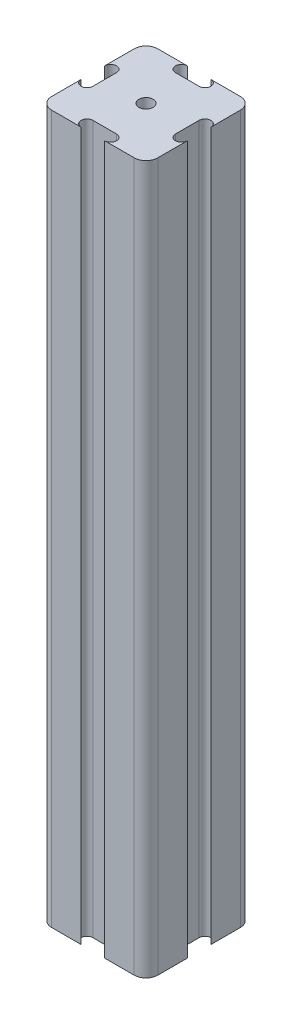
ISO-10303-21;
HEADER;
FILE_DESCRIPTION(('STEP AP214'),'2;1');
FILE_NAME('part.step','',(''),(''),'','','');
FILE_SCHEMA(('AUTOMOTIVE_DESIGN { 1 0 10303 214 1 1 1 1 }'));
ENDSEC;
DATA;
#1=APPLICATION_CONTEXT('core data for automotive mechanical design processes');
#2=APPLICATION_PROTOCOL_DEFINITION('international standard','automotive_design',2000,#1);
#3=PRODUCT_CONTEXT('',#1,'mechanical');
#4=PRODUCT('Part','Part','',(#3));
#5=PRODUCT_RELATED_PRODUCT_CATEGORY('part','',(#4));
#6=PRODUCT_DEFINITION_FORMATION('','',#4);
#7=PRODUCT_DEFINITION_CONTEXT('part definition',#1,'design');
#8=PRODUCT_DEFINITION('design','',#6,#7);
#9=PRODUCT_DEFINITION_SHAPE('','',#8);
#10=(LENGTH_UNIT() NAMED_UNIT(*) SI_UNIT(.MILLI.,.METRE.));
#11=(NAMED_UNIT(*) PLANE_ANGLE_UNIT() SI_UNIT($,.RADIAN.));
#12=(NAMED_UNIT(*) SI_UNIT($,.STERADIAN.) SOLID_ANGLE_UNIT());
#13=UNCERTAINTY_MEASURE_WITH_UNIT(LENGTH_MEASURE(1.E-05),#10,'distance_accuracy_value','');
#14=(GEOMETRIC_REPRESENTATION_CONTEXT(3) GLOBAL_UNCERTAINTY_ASSIGNED_CONTEXT((#13)) GLOBAL_UNIT_ASSIGNED_CONTEXT((#10,
#11,#12)) REPRESENTATION_CONTEXT('',''));
#15=CARTESIAN_POINT('',(0.,0.,0.));
#16=DIRECTION('',(0.,0.,1.));
#17=DIRECTION('',(1.,0.,0.));
#18=AXIS2_PLACEMENT_3D('',#15,#16,#17);
#19=CARTESIAN_POINT('',(-20.,300.,5.));
#20=DIRECTION('',(0.,-1.,0.));
#21=DIRECTION('',(0.,0.,-1.));
#22=AXIS2_PLACEMENT_3D('',#19,#20,#21);
#23=CYLINDRICAL_SURFACE('',#22,2.5);
#24=CARTESIAN_POINT('',(-20.,0.,5.));
#25=DIRECTION('',(0.,-1.,0.));
#26=DIRECTION('',(0.,0.,-1.));
#27=AXIS2_PLACEMENT_3D('',#24,#25,#26);
#28=CIRCLE('',#27,2.5);
#29=CARTESIAN_POINT('',(-17.5,0.,5.));
#30=VERTEX_POINT('',#29);
#31=CARTESIAN_POINT('',(-22.5,0.,5.));
#32=VERTEX_POINT('',#31);
#33=EDGE_CURVE('E225',#30,#32,#28,.T.);
#34=ORIENTED_EDGE('',*,*,#33,.T.);
#35=DIRECTION('',(0.,-1.,0.));
#36=VECTOR('',#35,1.);
#37=CARTESIAN_POINT('',(-22.5,300.,5.));
#38=LINE('',#37,#36);
#39=CARTESIAN_POINT('',(-22.5,300.,5.));
#40=VERTEX_POINT('',#39);
#41=EDGE_CURVE('E11',#40,#32,#38,.T.);
#42=ORIENTED_EDGE('',*,*,#41,.F.);
#43=CARTESIAN_POINT('',(-20.,300.,5.));
#44=DIRECTION('',(0.,-1.,0.));
#45=DIRECTION('',(0.,0.,-1.));
#46=AXIS2_PLACEMENT_3D('',#43,#44,#45);
#47=CIRCLE('',#46,2.5);
#48=CARTESIAN_POINT('',(-17.5,300.,5.));
#49=VERTEX_POINT('',#48);
#50=EDGE_CURVE('E290',#49,#40,#47,.T.);
#51=ORIENTED_EDGE('',*,*,#50,.F.);
#52=DIRECTION('',(0.,-1.,0.));
#53=VECTOR('',#52,1.);
#54=CARTESIAN_POINT('',(-17.5,300.,5.));
#55=LINE('',#54,#53);
#56=EDGE_CURVE('E221',#49,#30,#55,.T.);
#57=ORIENTED_EDGE('',*,*,#56,.T.);
#58=EDGE_LOOP('',(#34,#42,#51,#57));
#59=FACE_BOUND('',#58,.T.);
#60=ADVANCED_FACE('F33',(#59),#23,.F.);
#61=CARTESIAN_POINT('',(-22.5,300.,5.));
#62=DIRECTION('',(1.,0.,0.));
#63=DIRECTION('',(0.,0.,-1.));
#64=AXIS2_PLACEMENT_3D('',#61,#62,#63);
#65=PLANE('',#64);
#66=DIRECTION('',(0.,0.,1.));
#67=VECTOR('',#66,1.);
#68=CARTESIAN_POINT('',(-22.5,0.,5.));
#69=LINE('',#68,#67);
#70=CARTESIAN_POINT('',(-22.5,0.,17.4999999999999));
#71=VERTEX_POINT('',#70);
#72=EDGE_CURVE('E228',#32,#71,#69,.T.);
#73=ORIENTED_EDGE('',*,*,#72,.T.);
#74=DIRECTION('',(0.,-1.,0.));
#75=VECTOR('',#74,1.);
#76=CARTESIAN_POINT('',(-22.5,300.,17.4999999999999));
#77=LINE('',#76,#75);
#78=CARTESIAN_POINT('',(-22.5,300.,17.4999999999999));
#79=VERTEX_POINT('',#78);
#80=EDGE_CURVE('E41',#79,#71,#77,.T.);
#81=ORIENTED_EDGE('',*,*,#80,.F.);
#82=DIRECTION('',(0.,0.,1.));
#83=VECTOR('',#82,1.);
#84=CARTESIAN_POINT('',(-22.5,300.,5.));
#85=LINE('',#84,#83);
#86=EDGE_CURVE('E136',#40,#79,#85,.T.);
#87=ORIENTED_EDGE('',*,*,#86,.F.);
#88=ORIENTED_EDGE('',*,*,#41,.T.);
#89=EDGE_LOOP('',(#73,#81,#87,#88));
#90=FACE_BOUND('',#89,.T.);
#91=ADVANCED_FACE('F417',(#90),#65,.F.);
#92=CARTESIAN_POINT('',(-17.5,300.,17.5));
#93=DIRECTION('',(0.,-1.,0.));
#94=DIRECTION('',(0.,0.,-1.));
#95=AXIS2_PLACEMENT_3D('',#92,#93,#94);
#96=CYLINDRICAL_SURFACE('',#95,5.);
#97=CARTESIAN_POINT('',(-17.5,0.,17.5));
#98=DIRECTION('',(0.,1.,0.));
#99=DIRECTION('',(0.,0.,1.));
#100=AXIS2_PLACEMENT_3D('',#97,#98,#99);
#101=CIRCLE('',#100,5.);
#102=CARTESIAN_POINT('',(-17.5,0.,22.5));
#103=VERTEX_POINT('',#102);
#104=EDGE_CURVE('E231',#71,#103,#101,.T.);
#105=ORIENTED_EDGE('',*,*,#104,.T.);
#106=DIRECTION('',(0.,-1.,0.));
#107=VECTOR('',#106,1.);
#108=CARTESIAN_POINT('',(-17.5,300.,22.5));
#109=LINE('',#108,#107);
#110=CARTESIAN_POINT('',(-17.5,300.,22.5));
#111=VERTEX_POINT('',#110);
#112=EDGE_CURVE('E329',#111,#103,#109,.T.);
#113=ORIENTED_EDGE('',*,*,#112,.F.);
#114=CARTESIAN_POINT('',(-17.5,300.,17.5));
#115=DIRECTION('',(0.,1.,0.));
#116=DIRECTION('',(0.,0.,1.));
#117=AXIS2_PLACEMENT_3D('',#114,#115,#116);
#118=CIRCLE('',#117,5.);
#119=EDGE_CURVE('E336',#79,#111,#118,.T.);
#120=ORIENTED_EDGE('',*,*,#119,.F.);
#121=ORIENTED_EDGE('',*,*,#80,.T.);
#122=EDGE_LOOP('',(#105,#113,#120,#121));
#123=FACE_BOUND('',#122,.T.);
#124=ADVANCED_FACE('F334',(#123),#96,.T.);
#125=CARTESIAN_POINT('',(-4.99999999999998,300.,22.5));
#126=DIRECTION('',(0.,0.,1.));
#127=DIRECTION('',(1.,0.,0.));
#128=AXIS2_PLACEMENT_3D('',#125,#126,#127);
#129=PLANE('',#128);
#130=DIRECTION('',(-1.,0.,0.));
#131=VECTOR('',#130,1.);
#132=CARTESIAN_POINT('',(-4.99999999999998,0.,22.5));
#133=LINE('',#132,#131);
#134=CARTESIAN_POINT('',(-4.99999999999998,0.,22.5));
#135=VERTEX_POINT('',#134);
#136=EDGE_CURVE('E234',#135,#103,#133,.T.);
#137=ORIENTED_EDGE('',*,*,#136,.F.);
#138=DIRECTION('',(0.,-1.,0.));
#139=VECTOR('',#138,1.);
#140=CARTESIAN_POINT('',(-4.99999999999998,300.,22.5));
#141=LINE('',#140,#139);
#142=CARTESIAN_POINT('',(-4.99999999999998,300.,22.5));
#143=VERTEX_POINT('',#142);
#144=EDGE_CURVE('E327',#143,#135,#141,.T.);
#145=ORIENTED_EDGE('',*,*,#144,.F.);
#146=DIRECTION('',(-1.,0.,0.));
#147=VECTOR('',#146,1.);
#148=CARTESIAN_POINT('',(-4.99999999999998,300.,22.5));
#149=LINE('',#148,#147);
#150=EDGE_CURVE('E347',#143,#111,#149,.T.);
#151=ORIENTED_EDGE('',*,*,#150,.T.);
#152=ORIENTED_EDGE('',*,*,#112,.T.);
#153=EDGE_LOOP('',(#137,#145,#151,#152));
#154=FACE_BOUND('',#153,.T.);
#155=ADVANCED_FACE('F344',(#154),#129,.T.);
#156=CARTESIAN_POINT('',(-5.,300.,20.));
#157=DIRECTION('',(0.,-1.,0.));
#158=DIRECTION('',(0.,0.,-1.));
#159=AXIS2_PLACEMENT_3D('',#156,#157,#158);
#160=CYLINDRICAL_SURFACE('',#159,2.5);
#161=CARTESIAN_POINT('',(-5.,0.,20.));
#162=DIRECTION('',(0.,1.,0.));
#163=DIRECTION('',(0.,0.,1.));
#164=AXIS2_PLACEMENT_3D('',#161,#162,#163);
#165=CIRCLE('',#164,2.5);
#166=CARTESIAN_POINT('',(-4.99999999999998,0.,17.5));
#167=VERTEX_POINT('',#166);
#168=EDGE_CURVE('E237',#167,#135,#165,.T.);
#169=ORIENTED_EDGE('',*,*,#168,.F.);
#170=DIRECTION('',(0.,-1.,0.));
#171=VECTOR('',#170,1.);
#172=CARTESIAN_POINT('',(-4.99999999999998,300.,17.5));
#173=LINE('',#172,#171);
#174=CARTESIAN_POINT('',(-4.99999999999998,300.,17.5));
#175=VERTEX_POINT('',#174);
#176=EDGE_CURVE('E325',#175,#167,#173,.T.);
#177=ORIENTED_EDGE('',*,*,#176,.F.);
#178=CARTESIAN_POINT('',(-5.,300.,20.));
#179=DIRECTION('',(0.,1.,0.));
#180=DIRECTION('',(0.,0.,1.));
#181=AXIS2_PLACEMENT_3D('',#178,#179,#180);
#182=CIRCLE('',#181,2.5);
#183=EDGE_CURVE('E350',#175,#143,#182,.T.);
#184=ORIENTED_EDGE('',*,*,#183,.T.);
#185=ORIENTED_EDGE('',*,*,#144,.T.);
#186=EDGE_LOOP('',(#169,#177,#184,#185));
#187=FACE_BOUND('',#186,.T.);
#188=ADVANCED_FACE('F624',(#187),#160,.F.);
#189=CARTESIAN_POINT('',(-4.99999999999998,300.,17.5));
#190=DIRECTION('',(0.,0.,-1.));
#191=DIRECTION('',(-1.,0.,0.));
#192=AXIS2_PLACEMENT_3D('',#189,#190,#191);
#193=PLANE('',#192);
#194=DIRECTION('',(1.,0.,0.));
#195=VECTOR('',#194,1.);
#196=CARTESIAN_POINT('',(-4.99999999999998,0.,17.5));
#197=LINE('',#196,#195);
#198=CARTESIAN_POINT('',(5.00000000000002,0.,17.5));
#199=VERTEX_POINT('',#198);
#200=EDGE_CURVE('E240',#167,#199,#197,.T.);
#201=ORIENTED_EDGE('',*,*,#200,.T.);
#202=DIRECTION('',(0.,-1.,0.));
#203=VECTOR('',#202,1.);
#204=CARTESIAN_POINT('',(5.00000000000002,300.,17.5));
#205=LINE('',#204,#203);
#206=CARTESIAN_POINT('',(5.00000000000002,300.,17.5));
#207=VERTEX_POINT('',#206);
#208=EDGE_CURVE('E323',#207,#199,#205,.T.);
#209=ORIENTED_EDGE('',*,*,#208,.F.);
#210=DIRECTION('',(1.,0.,0.));
#211=VECTOR('',#210,1.);
#212=CARTESIAN_POINT('',(-4.99999999999998,300.,17.5));
#213=LINE('',#212,#211);
#214=EDGE_CURVE('E352',#175,#207,#213,.T.);
#215=ORIENTED_EDGE('',*,*,#214,.F.);
#216=ORIENTED_EDGE('',*,*,#176,.T.);
#217=EDGE_LOOP('',(#201,#209,#215,#216));
#218=FACE_BOUND('',#217,.T.);
#219=ADVANCED_FACE('F614',(#218),#193,.F.);
#220=CARTESIAN_POINT('',(4.99999999999996,300.,20.));
#221=DIRECTION('',(0.,-1.,0.));
#222=DIRECTION('',(0.,0.,-1.));
#223=AXIS2_PLACEMENT_3D('',#220,#221,#222);
#224=CYLINDRICAL_SURFACE('',#223,2.50000000000001);
#225=CARTESIAN_POINT('',(4.99999999999996,0.,20.));
#226=DIRECTION('',(0.,1.,0.));
#227=DIRECTION('',(0.,0.,1.));
#228=AXIS2_PLACEMENT_3D('',#225,#226,#227);
#229=CIRCLE('',#228,2.50000000000001);
#230=CARTESIAN_POINT('',(4.99999999999996,0.,22.5));
#231=VERTEX_POINT('',#230);
#232=EDGE_CURVE('E243',#231,#199,#229,.T.);
#233=ORIENTED_EDGE('',*,*,#232,.F.);
#234=DIRECTION('',(0.,-1.,0.));
#235=VECTOR('',#234,1.);
#236=CARTESIAN_POINT('',(4.99999999999996,300.,22.5));
#237=LINE('',#236,#235);
#238=CARTESIAN_POINT('',(4.99999999999996,300.,22.5));
#239=VERTEX_POINT('',#238);
#240=EDGE_CURVE('E321',#239,#231,#237,.T.);
#241=ORIENTED_EDGE('',*,*,#240,.F.);
#242=CARTESIAN_POINT('',(4.99999999999996,300.,20.));
#243=DIRECTION('',(0.,1.,0.));
#244=DIRECTION('',(0.,0.,1.));
#245=AXIS2_PLACEMENT_3D('',#242,#243,#244);
#246=CIRCLE('',#245,2.50000000000001);
#247=EDGE_CURVE('E358',#239,#207,#246,.T.);
#248=ORIENTED_EDGE('',*,*,#247,.T.);
#249=ORIENTED_EDGE('',*,*,#208,.T.);
#250=EDGE_LOOP('',(#233,#241,#248,#249));
#251=FACE_BOUND('',#250,.T.);
#252=ADVANCED_FACE('F604',(#251),#224,.F.);
#253=CARTESIAN_POINT('',(4.99999999999996,300.,22.5));
#254=DIRECTION('',(0.,0.,-1.));
#255=DIRECTION('',(-1.,0.,0.));
#256=AXIS2_PLACEMENT_3D('',#253,#254,#255);
#257=PLANE('',#256);
#258=DIRECTION('',(1.,0.,0.));
#259=VECTOR('',#258,1.);
#260=CARTESIAN_POINT('',(4.99999999999996,0.,22.5));
#261=LINE('',#260,#259);
#262=CARTESIAN_POINT('',(17.5,0.,22.5));
#263=VERTEX_POINT('',#262);
#264=EDGE_CURVE('E246',#231,#263,#261,.T.);
#265=ORIENTED_EDGE('',*,*,#264,.T.);
#266=DIRECTION('',(0.,-1.,0.));
#267=VECTOR('',#266,1.);
#268=CARTESIAN_POINT('',(17.5,300.,22.5));
#269=LINE('',#268,#267);
#270=CARTESIAN_POINT('',(17.5,300.,22.5));
#271=VERTEX_POINT('',#270);
#272=EDGE_CURVE('E318',#271,#263,#269,.T.);
#273=ORIENTED_EDGE('',*,*,#272,.F.);
#274=DIRECTION('',(1.,0.,0.));
#275=VECTOR('',#274,1.);
#276=CARTESIAN_POINT('',(4.99999999999996,300.,22.5));
#277=LINE('',#276,#275);
#278=EDGE_CURVE('E361',#239,#271,#277,.T.);
#279=ORIENTED_EDGE('',*,*,#278,.F.);
#280=ORIENTED_EDGE('',*,*,#240,.T.);
#281=EDGE_LOOP('',(#265,#273,#279,#280));
#282=FACE_BOUND('',#281,.T.);
#283=ADVANCED_FACE('F594',(#282),#257,.F.);
#284=CARTESIAN_POINT('',(17.5000000000006,300.,17.5));
#285=DIRECTION('',(0.,-1.,0.));
#286=DIRECTION('',(0.,0.,-1.));
#287=AXIS2_PLACEMENT_3D('',#284,#285,#286);
#288=CYLINDRICAL_SURFACE('',#287,5.);
#289=CARTESIAN_POINT('',(17.5000000000006,0.,17.5));
#290=DIRECTION('',(0.,1.,0.));
#291=DIRECTION('',(0.,0.,1.));
#292=AXIS2_PLACEMENT_3D('',#289,#290,#291);
#293=CIRCLE('',#292,5.);
#294=CARTESIAN_POINT('',(22.5,0.,17.5000025246919));
#295=VERTEX_POINT('',#294);
#296=EDGE_CURVE('E248',#263,#295,#293,.T.);
#297=ORIENTED_EDGE('',*,*,#296,.T.);
#298=DIRECTION('',(0.,-1.,0.));
#299=VECTOR('',#298,1.);
#300=CARTESIAN_POINT('',(22.5,300.,17.5000025246919));
#301=LINE('',#300,#299);
#302=CARTESIAN_POINT('',(22.5,300.,17.5000025246919));
#303=VERTEX_POINT('',#302);
#304=EDGE_CURVE('E316',#303,#295,#301,.T.);
#305=ORIENTED_EDGE('',*,*,#304,.F.);
#306=CARTESIAN_POINT('',(17.5000000000006,300.,17.5));
#307=DIRECTION('',(0.,1.,0.));
#308=DIRECTION('',(0.,0.,1.));
#309=AXIS2_PLACEMENT_3D('',#306,#307,#308);
#310=CIRCLE('',#309,5.);
#311=EDGE_CURVE('E363',#271,#303,#310,.T.);
#312=ORIENTED_EDGE('',*,*,#311,.F.);
#313=ORIENTED_EDGE('',*,*,#272,.T.);
#314=EDGE_LOOP('',(#297,#305,#312,#313));
#315=FACE_BOUND('',#314,.T.);
#316=ADVANCED_FACE('F584',(#315),#288,.T.);
#317=CARTESIAN_POINT('',(22.5,300.,5.00000252469196));
#318=DIRECTION('',(1.,0.,0.));
#319=DIRECTION('',(0.,0.,-1.));
#320=AXIS2_PLACEMENT_3D('',#317,#318,#319);
#321=PLANE('',#320);
#322=DIRECTION('',(0.,0.,1.));
#323=VECTOR('',#322,1.);
#324=CARTESIAN_POINT('',(22.5,0.,5.00000252469196));
#325=LINE('',#324,#323);
#326=CARTESIAN_POINT('',(22.5,0.,5.00000252469196));
#327=VERTEX_POINT('',#326);
#328=EDGE_CURVE('E251',#327,#295,#325,.T.);
#329=ORIENTED_EDGE('',*,*,#328,.F.);
#330=DIRECTION('',(0.,-1.,0.));
#331=VECTOR('',#330,1.);
#332=CARTESIAN_POINT('',(22.5,300.,5.00000252469196));
#333=LINE('',#332,#331);
#334=CARTESIAN_POINT('',(22.5,300.,5.00000252469196));
#335=VERTEX_POINT('',#334);
#336=EDGE_CURVE('E314',#335,#327,#333,.T.);
#337=ORIENTED_EDGE('',*,*,#336,.F.);
#338=DIRECTION('',(0.,0.,1.));
#339=VECTOR('',#338,1.);
#340=CARTESIAN_POINT('',(22.5,300.,5.00000252469196));
#341=LINE('',#340,#339);
#342=EDGE_CURVE('E365',#335,#303,#341,.T.);
#343=ORIENTED_EDGE('',*,*,#342,.T.);
#344=ORIENTED_EDGE('',*,*,#304,.T.);
#345=EDGE_LOOP('',(#329,#337,#343,#344));
#346=FACE_BOUND('',#345,.T.);
#347=ADVANCED_FACE('F574',(#346),#321,.T.);
#348=CARTESIAN_POINT('',(20.,300.,5.00000252469196));
#349=DIRECTION('',(0.,-1.,0.));
#350=DIRECTION('',(0.,0.,-1.));
#351=AXIS2_PLACEMENT_3D('',#348,#349,#350);
#352=CYLINDRICAL_SURFACE('',#351,2.5);
#353=CARTESIAN_POINT('',(20.,0.,5.00000252469196));
#354=DIRECTION('',(0.,-1.,0.));
#355=DIRECTION('',(0.,0.,-1.));
#356=AXIS2_PLACEMENT_3D('',#353,#354,#355);
#357=CIRCLE('',#356,2.5);
#358=CARTESIAN_POINT('',(17.5,0.,5.00000252469196));
#359=VERTEX_POINT('',#358);
#360=EDGE_CURVE('E254',#327,#359,#357,.T.);
#361=ORIENTED_EDGE('',*,*,#360,.T.);
#362=DIRECTION('',(0.,-1.,0.));
#363=VECTOR('',#362,1.);
#364=CARTESIAN_POINT('',(17.5,300.,5.00000252469196));
#365=LINE('',#364,#363);
#366=CARTESIAN_POINT('',(17.5,300.,5.00000252469196));
#367=VERTEX_POINT('',#366);
#368=EDGE_CURVE('E312',#367,#359,#365,.T.);
#369=ORIENTED_EDGE('',*,*,#368,.F.);
#370=CARTESIAN_POINT('',(20.,300.,5.00000252469196));
#371=DIRECTION('',(0.,-1.,0.));
#372=DIRECTION('',(0.,0.,-1.));
#373=AXIS2_PLACEMENT_3D('',#370,#371,#372);
#374=CIRCLE('',#373,2.5);
#375=EDGE_CURVE('E368',#335,#367,#374,.T.);
#376=ORIENTED_EDGE('',*,*,#375,.F.);
#377=ORIENTED_EDGE('',*,*,#336,.T.);
#378=EDGE_LOOP('',(#361,#369,#376,#377));
#379=FACE_BOUND('',#378,.T.);
#380=ADVANCED_FACE('F564',(#379),#352,.F.);
#381=CARTESIAN_POINT('',(17.5,300.,-4.99999747530804));
#382=DIRECTION('',(1.,0.,0.));
#383=DIRECTION('',(0.,0.,-1.));
#384=AXIS2_PLACEMENT_3D('',#381,#382,#383);
#385=PLANE('',#384);
#386=DIRECTION('',(0.,0.,1.));
#387=VECTOR('',#386,1.);
#388=CARTESIAN_POINT('',(17.5,0.,-4.99999747530804));
#389=LINE('',#388,#387);
#390=CARTESIAN_POINT('',(17.5,0.,-4.99999747530804));
#391=VERTEX_POINT('',#390);
#392=EDGE_CURVE('E257',#391,#359,#389,.T.);
#393=ORIENTED_EDGE('',*,*,#392,.F.);
#394=DIRECTION('',(0.,-1.,0.));
#395=VECTOR('',#394,1.);
#396=CARTESIAN_POINT('',(17.5,300.,-4.99999747530804));
#397=LINE('',#396,#395);
#398=CARTESIAN_POINT('',(17.5,300.,-4.99999747530804));
#399=VERTEX_POINT('',#398);
#400=EDGE_CURVE('E310',#399,#391,#397,.T.);
#401=ORIENTED_EDGE('',*,*,#400,.F.);
#402=DIRECTION('',(0.,0.,1.));
#403=VECTOR('',#402,1.);
#404=CARTESIAN_POINT('',(17.5,300.,-4.99999747530804));
#405=LINE('',#404,#403);
#406=EDGE_CURVE('E370',#399,#367,#405,.T.);
#407=ORIENTED_EDGE('',*,*,#406,.T.);
#408=ORIENTED_EDGE('',*,*,#368,.T.);
#409=EDGE_LOOP('',(#393,#401,#407,#408));
#410=FACE_BOUND('',#409,.T.);
#411=ADVANCED_FACE('F554',(#410),#385,.T.);
#412=CARTESIAN_POINT('',(20.,300.,-4.99999747530804));
#413=DIRECTION('',(0.,-1.,0.));
#414=DIRECTION('',(0.,0.,-1.));
#415=AXIS2_PLACEMENT_3D('',#412,#413,#414);
#416=CYLINDRICAL_SURFACE('',#415,2.5);
#417=CARTESIAN_POINT('',(20.,0.,-4.99999747530804));
#418=DIRECTION('',(0.,1.,0.));
#419=DIRECTION('',(0.,0.,1.));
#420=AXIS2_PLACEMENT_3D('',#417,#418,#419);
#421=CIRCLE('',#420,2.5);
#422=CARTESIAN_POINT('',(22.5,0.,-4.99999747530804));
#423=VERTEX_POINT('',#422);
#424=EDGE_CURVE('E260',#423,#391,#421,.T.);
#425=ORIENTED_EDGE('',*,*,#424,.F.);
#426=DIRECTION('',(0.,-1.,0.));
#427=VECTOR('',#426,1.);
#428=CARTESIAN_POINT('',(22.5,300.,-4.99999747530804));
#429=LINE('',#428,#427);
#430=CARTESIAN_POINT('',(22.5,300.,-4.99999747530804));
#431=VERTEX_POINT('',#430);
#432=EDGE_CURVE('E308',#431,#423,#429,.T.);
#433=ORIENTED_EDGE('',*,*,#432,.F.);
#434=CARTESIAN_POINT('',(20.,300.,-4.99999747530804));
#435=DIRECTION('',(0.,1.,0.));
#436=DIRECTION('',(0.,0.,1.));
#437=AXIS2_PLACEMENT_3D('',#434,#435,#436);
#438=CIRCLE('',#437,2.5);
#439=EDGE_CURVE('E373',#431,#399,#438,.T.);
#440=ORIENTED_EDGE('',*,*,#439,.T.);
#441=ORIENTED_EDGE('',*,*,#400,.T.);
#442=EDGE_LOOP('',(#425,#433,#440,#441));
#443=FACE_BOUND('',#442,.T.);
#444=ADVANCED_FACE('F544',(#443),#416,.F.);
#445=CARTESIAN_POINT('',(22.5,300.,-4.99999747530804));
#446=DIRECTION('',(-1.,0.,0.));
#447=DIRECTION('',(0.,0.,1.));
#448=AXIS2_PLACEMENT_3D('',#445,#446,#447);
#449=PLANE('',#448);
#450=DIRECTION('',(0.,0.,-1.));
#451=VECTOR('',#450,1.);
#452=CARTESIAN_POINT('',(22.5,0.,-4.99999747530804));
#453=LINE('',#452,#451);
#454=CARTESIAN_POINT('',(22.5,0.,-17.499997475308));
#455=VERTEX_POINT('',#454);
#456=EDGE_CURVE('E263',#423,#455,#453,.T.);
#457=ORIENTED_EDGE('',*,*,#456,.T.);
#458=DIRECTION('',(0.,-1.,0.));
#459=VECTOR('',#458,1.);
#460=CARTESIAN_POINT('',(22.5,300.,-17.499997475308));
#461=LINE('',#460,#459);
#462=CARTESIAN_POINT('',(22.5,300.,-17.499997475308));
#463=VERTEX_POINT('',#462);
#464=EDGE_CURVE('E306',#463,#455,#461,.T.);
#465=ORIENTED_EDGE('',*,*,#464,.F.);
#466=DIRECTION('',(0.,0.,-1.));
#467=VECTOR('',#466,1.);
#468=CARTESIAN_POINT('',(22.5,300.,-4.99999747530804));
#469=LINE('',#468,#467);
#470=EDGE_CURVE('E376',#431,#463,#469,.T.);
#471=ORIENTED_EDGE('',*,*,#470,.F.);
#472=ORIENTED_EDGE('',*,*,#432,.T.);
#473=EDGE_LOOP('',(#457,#465,#471,#472));
#474=FACE_BOUND('',#473,.T.);
#475=ADVANCED_FACE('F534',(#474),#449,.F.);
#476=CARTESIAN_POINT('',(17.5000000000006,300.,-17.5));
#477=DIRECTION('',(0.,-1.,0.));
#478=DIRECTION('',(0.,0.,-1.));
#479=AXIS2_PLACEMENT_3D('',#476,#477,#478);
#480=CYLINDRICAL_SURFACE('',#479,5.00000000000001);
#481=CARTESIAN_POINT('',(17.5000000000006,0.,-17.5));
#482=DIRECTION('',(0.,-1.,0.));
#483=DIRECTION('',(0.,0.,-1.));
#484=AXIS2_PLACEMENT_3D('',#481,#482,#483);
#485=CIRCLE('',#484,5.00000000000001);
#486=CARTESIAN_POINT('',(17.5,0.,-22.5));
#487=VERTEX_POINT('',#486);
#488=EDGE_CURVE('E266',#487,#455,#485,.T.);
#489=ORIENTED_EDGE('',*,*,#488,.F.);
#490=DIRECTION('',(0.,-1.,0.));
#491=VECTOR('',#490,1.);
#492=CARTESIAN_POINT('',(17.5,300.,-22.5));
#493=LINE('',#492,#491);
#494=CARTESIAN_POINT('',(17.5,300.,-22.5));
#495=VERTEX_POINT('',#494);
#496=EDGE_CURVE('E304',#495,#487,#493,.T.);
#497=ORIENTED_EDGE('',*,*,#496,.F.);
#498=CARTESIAN_POINT('',(17.5000000000006,300.,-17.5));
#499=DIRECTION('',(0.,-1.,0.));
#500=DIRECTION('',(0.,0.,-1.));
#501=AXIS2_PLACEMENT_3D('',#498,#499,#500);
#502=CIRCLE('',#501,5.00000000000001);
#503=EDGE_CURVE('E378',#495,#463,#502,.T.);
#504=ORIENTED_EDGE('',*,*,#503,.T.);
#505=ORIENTED_EDGE('',*,*,#464,.T.);
#506=EDGE_LOOP('',(#489,#497,#504,#505));
#507=FACE_BOUND('',#506,.T.);
#508=ADVANCED_FACE('F524',(#507),#480,.T.);
#509=CARTESIAN_POINT('',(5.00000000000003,300.,-22.5));
#510=DIRECTION('',(0.,0.,-1.));
#511=DIRECTION('',(-1.,0.,0.));
#512=AXIS2_PLACEMENT_3D('',#509,#510,#511);
#513=PLANE('',#512);
#514=DIRECTION('',(1.,0.,0.));
#515=VECTOR('',#514,1.);
#516=CARTESIAN_POINT('',(5.00000000000003,0.,-22.5));
#517=LINE('',#516,#515);
#518=CARTESIAN_POINT('',(5.00000000000003,0.,-22.5));
#519=VERTEX_POINT('',#518);
#520=EDGE_CURVE('E269',#519,#487,#517,.T.);
#521=ORIENTED_EDGE('',*,*,#520,.F.);
#522=DIRECTION('',(0.,-1.,0.));
#523=VECTOR('',#522,1.);
#524=CARTESIAN_POINT('',(5.00000000000003,300.,-22.5));
#525=LINE('',#524,#523);
#526=CARTESIAN_POINT('',(5.00000000000003,300.,-22.5));
#527=VERTEX_POINT('',#526);
#528=EDGE_CURVE('E302',#527,#519,#525,.T.);
#529=ORIENTED_EDGE('',*,*,#528,.F.);
#530=DIRECTION('',(1.,0.,0.));
#531=VECTOR('',#530,1.);
#532=CARTESIAN_POINT('',(5.00000000000003,300.,-22.5));
#533=LINE('',#532,#531);
#534=EDGE_CURVE('E381',#527,#495,#533,.T.);
#535=ORIENTED_EDGE('',*,*,#534,.T.);
#536=ORIENTED_EDGE('',*,*,#496,.T.);
#537=EDGE_LOOP('',(#521,#529,#535,#536));
#538=FACE_BOUND('',#537,.T.);
#539=ADVANCED_FACE('F514',(#538),#513,.T.);
#540=CARTESIAN_POINT('',(5.00000000000003,300.,-20.));
#541=DIRECTION('',(0.,-1.,0.));
#542=DIRECTION('',(0.,0.,-1.));
#543=AXIS2_PLACEMENT_3D('',#540,#541,#542);
#544=CYLINDRICAL_SURFACE('',#543,2.50000000000001);
#545=CARTESIAN_POINT('',(5.00000000000003,0.,-20.));
#546=DIRECTION('',(0.,1.,0.));
#547=DIRECTION('',(0.,0.,1.));
#548=AXIS2_PLACEMENT_3D('',#545,#546,#547);
#549=CIRCLE('',#548,2.50000000000001);
#550=CARTESIAN_POINT('',(5.00000000000001,0.,-17.5));
#551=VERTEX_POINT('',#550);
#552=EDGE_CURVE('E272',#551,#519,#549,.T.);
#553=ORIENTED_EDGE('',*,*,#552,.F.);
#554=DIRECTION('',(0.,-1.,0.));
#555=VECTOR('',#554,1.);
#556=CARTESIAN_POINT('',(5.00000000000001,300.,-17.5));
#557=LINE('',#556,#555);
#558=CARTESIAN_POINT('',(5.00000000000001,300.,-17.5));
#559=VERTEX_POINT('',#558);
#560=EDGE_CURVE('E300',#559,#551,#557,.T.);
#561=ORIENTED_EDGE('',*,*,#560,.F.);
#562=CARTESIAN_POINT('',(5.00000000000003,300.,-20.));
#563=DIRECTION('',(0.,1.,0.));
#564=DIRECTION('',(0.,0.,1.));
#565=AXIS2_PLACEMENT_3D('',#562,#563,#564);
#566=CIRCLE('',#565,2.50000000000001);
#567=EDGE_CURVE('E384',#559,#527,#566,.T.);
#568=ORIENTED_EDGE('',*,*,#567,.T.);
#569=ORIENTED_EDGE('',*,*,#528,.T.);
#570=EDGE_LOOP('',(#553,#561,#568,#569));
#571=FACE_BOUND('',#570,.T.);
#572=ADVANCED_FACE('F504',(#571),#544,.F.);
#573=CARTESIAN_POINT('',(-5.,300.,-17.5));
#574=DIRECTION('',(0.,0.,-1.));
#575=DIRECTION('',(-1.,0.,0.));
#576=AXIS2_PLACEMENT_3D('',#573,#574,#575);
#577=PLANE('',#576);
#578=DIRECTION('',(1.,0.,0.));
#579=VECTOR('',#578,1.);
#580=CARTESIAN_POINT('',(-5.,0.,-17.5));
#581=LINE('',#580,#579);
#582=CARTESIAN_POINT('',(-5.,0.,-17.5));
#583=VERTEX_POINT('',#582);
#584=EDGE_CURVE('E275',#583,#551,#581,.T.);
#585=ORIENTED_EDGE('',*,*,#584,.F.);
#586=DIRECTION('',(0.,-1.,0.));
#587=VECTOR('',#586,1.);
#588=CARTESIAN_POINT('',(-5.,300.,-17.5));
#589=LINE('',#588,#587);
#590=CARTESIAN_POINT('',(-5.,300.,-17.5));
#591=VERTEX_POINT('',#590);
#592=EDGE_CURVE('E298',#591,#583,#589,.T.);
#593=ORIENTED_EDGE('',*,*,#592,.F.);
#594=DIRECTION('',(1.,0.,0.));
#595=VECTOR('',#594,1.);
#596=CARTESIAN_POINT('',(-5.,300.,-17.5));
#597=LINE('',#596,#595);
#598=EDGE_CURVE('E387',#591,#559,#597,.T.);
#599=ORIENTED_EDGE('',*,*,#598,.T.);
#600=ORIENTED_EDGE('',*,*,#560,.T.);
#601=EDGE_LOOP('',(#585,#593,#599,#600));
#602=FACE_BOUND('',#601,.T.);
#603=ADVANCED_FACE('F495',(#602),#577,.T.);
#604=CARTESIAN_POINT('',(-5.00000000000003,300.,-20.));
#605=DIRECTION('',(0.,-1.,0.));
#606=DIRECTION('',(0.,0.,-1.));
#607=AXIS2_PLACEMENT_3D('',#604,#605,#606);
#608=CYLINDRICAL_SURFACE('',#607,2.5);
#609=CARTESIAN_POINT('',(-5.00000000000003,0.,-20.));
#610=DIRECTION('',(0.,1.,0.));
#611=DIRECTION('',(0.,0.,1.));
#612=AXIS2_PLACEMENT_3D('',#609,#610,#611);
#613=CIRCLE('',#612,2.5);
#614=CARTESIAN_POINT('',(-5.00000000000003,0.,-22.5));
#615=VERTEX_POINT('',#614);
#616=EDGE_CURVE('E278',#615,#583,#613,.T.);
#617=ORIENTED_EDGE('',*,*,#616,.F.);
#618=DIRECTION('',(0.,-1.,0.));
#619=VECTOR('',#618,1.);
#620=CARTESIAN_POINT('',(-5.00000000000003,300.,-22.5));
#621=LINE('',#620,#619);
#622=CARTESIAN_POINT('',(-5.00000000000003,300.,-22.5));
#623=VERTEX_POINT('',#622);
#624=EDGE_CURVE('E296',#623,#615,#621,.T.);
#625=ORIENTED_EDGE('',*,*,#624,.F.);
#626=CARTESIAN_POINT('',(-5.00000000000003,300.,-20.));
#627=DIRECTION('',(0.,1.,0.));
#628=DIRECTION('',(0.,0.,1.));
#629=AXIS2_PLACEMENT_3D('',#626,#627,#628);
#630=CIRCLE('',#629,2.5);
#631=EDGE_CURVE('E390',#623,#591,#630,.T.);
#632=ORIENTED_EDGE('',*,*,#631,.T.);
#633=ORIENTED_EDGE('',*,*,#592,.T.);
#634=EDGE_LOOP('',(#617,#625,#632,#633));
#635=FACE_BOUND('',#634,.T.);
#636=ADVANCED_FACE('F403',(#635),#608,.F.);
#637=CARTESIAN_POINT('',(-17.5,300.,-22.5));
#638=DIRECTION('',(0.,0.,-1.));
#639=DIRECTION('',(-1.,0.,0.));
#640=AXIS2_PLACEMENT_3D('',#637,#638,#639);
#641=PLANE('',#640);
#642=DIRECTION('',(1.,0.,0.));
#643=VECTOR('',#642,1.);
#644=CARTESIAN_POINT('',(-17.5,0.,-22.5));
#645=LINE('',#644,#643);
#646=CARTESIAN_POINT('',(-17.5,0.,-22.5));
#647=VERTEX_POINT('',#646);
#648=EDGE_CURVE('E281',#647,#615,#645,.T.);
#649=ORIENTED_EDGE('',*,*,#648,.F.);
#650=DIRECTION('',(0.,-1.,0.));
#651=VECTOR('',#650,1.);
#652=CARTESIAN_POINT('',(-17.5,300.,-22.5));
#653=LINE('',#652,#651);
#654=CARTESIAN_POINT('',(-17.5,300.,-22.5));
#655=VERTEX_POINT('',#654);
#656=EDGE_CURVE('E294',#655,#647,#653,.T.);
#657=ORIENTED_EDGE('',*,*,#656,.F.);
#658=DIRECTION('',(1.,0.,0.));
#659=VECTOR('',#658,1.);
#660=CARTESIAN_POINT('',(-17.5,300.,-22.5));
#661=LINE('',#660,#659);
#662=EDGE_CURVE('E393',#655,#623,#661,.T.);
#663=ORIENTED_EDGE('',*,*,#662,.T.);
#664=ORIENTED_EDGE('',*,*,#624,.T.);
#665=EDGE_LOOP('',(#649,#657,#663,#664));
#666=FACE_BOUND('',#665,.T.);
#667=ADVANCED_FACE('F397',(#666),#641,.T.);
#668=CARTESIAN_POINT('',(-17.5,300.,-17.5));
#669=DIRECTION('',(0.,-1.,0.));
#670=DIRECTION('',(0.,0.,-1.));
#671=AXIS2_PLACEMENT_3D('',#668,#669,#670);
#672=CYLINDRICAL_SURFACE('',#671,5.00000000000001);
#673=CARTESIAN_POINT('',(-17.5,0.,-17.5));
#674=DIRECTION('',(0.,1.,0.));
#675=DIRECTION('',(0.,0.,1.));
#676=AXIS2_PLACEMENT_3D('',#673,#674,#675);
#677=CIRCLE('',#676,5.00000000000001);
#678=CARTESIAN_POINT('',(-22.5,0.,-17.5));
#679=VERTEX_POINT('',#678);
#680=EDGE_CURVE('E284',#647,#679,#677,.T.);
#681=ORIENTED_EDGE('',*,*,#680,.T.);
#682=DIRECTION('',(0.,-1.,0.));
#683=VECTOR('',#682,1.);
#684=CARTESIAN_POINT('',(-22.5,300.,-17.5));
#685=LINE('',#684,#683);
#686=CARTESIAN_POINT('',(-22.5,300.,-17.5));
#687=VERTEX_POINT('',#686);
#688=EDGE_CURVE('E217',#687,#679,#685,.T.);
#689=ORIENTED_EDGE('',*,*,#688,.F.);
#690=CARTESIAN_POINT('',(-17.5,300.,-17.5));
#691=DIRECTION('',(0.,1.,0.));
#692=DIRECTION('',(0.,0.,1.));
#693=AXIS2_PLACEMENT_3D('',#690,#691,#692);
#694=CIRCLE('',#693,5.00000000000001);
#695=EDGE_CURVE('E204',#655,#687,#694,.T.);
#696=ORIENTED_EDGE('',*,*,#695,.F.);
#697=ORIENTED_EDGE('',*,*,#656,.T.);
#698=EDGE_LOOP('',(#681,#689,#696,#697));
#699=FACE_BOUND('',#698,.T.);
#700=ADVANCED_FACE('F407',(#699),#672,.T.);
#701=CARTESIAN_POINT('',(-22.5,300.,-17.5));
#702=DIRECTION('',(1.,0.,0.));
#703=DIRECTION('',(0.,0.,-1.));
#704=AXIS2_PLACEMENT_3D('',#701,#702,#703);
#705=PLANE('',#704);
#706=DIRECTION('',(0.,0.,1.));
#707=VECTOR('',#706,1.);
#708=CARTESIAN_POINT('',(-22.5,0.,-17.5));
#709=LINE('',#708,#707);
#710=CARTESIAN_POINT('',(-22.5,0.,-5.));
#711=VERTEX_POINT('',#710);
#712=EDGE_CURVE('E213',#679,#711,#709,.T.);
#713=ORIENTED_EDGE('',*,*,#712,.T.);
#714=DIRECTION('',(0.,-1.,0.));
#715=VECTOR('',#714,1.);
#716=CARTESIAN_POINT('',(-22.5,300.,-5.));
#717=LINE('',#716,#715);
#718=CARTESIAN_POINT('',(-22.5,300.,-5.));
#719=VERTEX_POINT('',#718);
#720=EDGE_CURVE('E210',#719,#711,#717,.T.);
#721=ORIENTED_EDGE('',*,*,#720,.F.);
#722=DIRECTION('',(0.,0.,1.));
#723=VECTOR('',#722,1.);
#724=CARTESIAN_POINT('',(-22.5,300.,-17.5));
#725=LINE('',#724,#723);
#726=EDGE_CURVE('E197',#687,#719,#725,.T.);
#727=ORIENTED_EDGE('',*,*,#726,.F.);
#728=ORIENTED_EDGE('',*,*,#688,.T.);
#729=EDGE_LOOP('',(#713,#721,#727,#728));
#730=FACE_BOUND('',#729,.T.);
#731=ADVANCED_FACE('F211',(#730),#705,.F.);
#732=CARTESIAN_POINT('',(-20.,300.,-5.));
#733=DIRECTION('',(0.,-1.,0.));
#734=DIRECTION('',(0.,0.,-1.));
#735=AXIS2_PLACEMENT_3D('',#732,#733,#734);
#736=CYLINDRICAL_SURFACE('',#735,2.5);
#737=CARTESIAN_POINT('',(-20.,0.,-5.));
#738=DIRECTION('',(0.,1.,0.));
#739=DIRECTION('',(0.,0.,1.));
#740=AXIS2_PLACEMENT_3D('',#737,#738,#739);
#741=CIRCLE('',#740,2.5);
#742=CARTESIAN_POINT('',(-17.5,0.,-5.));
#743=VERTEX_POINT('',#742);
#744=EDGE_CURVE('E287',#743,#711,#741,.T.);
#745=ORIENTED_EDGE('',*,*,#744,.F.);
#746=DIRECTION('',(0.,-1.,0.));
#747=VECTOR('',#746,1.);
#748=CARTESIAN_POINT('',(-17.5,300.,-5.));
#749=LINE('',#748,#747);
#750=CARTESIAN_POINT('',(-17.5,300.,-5.));
#751=VERTEX_POINT('',#750);
#752=EDGE_CURVE('E125',#751,#743,#749,.T.);
#753=ORIENTED_EDGE('',*,*,#752,.F.);
#754=CARTESIAN_POINT('',(-20.,300.,-5.));
#755=DIRECTION('',(0.,1.,0.));
#756=DIRECTION('',(0.,0.,1.));
#757=AXIS2_PLACEMENT_3D('',#754,#755,#756);
#758=CIRCLE('',#757,2.5);
#759=EDGE_CURVE('E201',#751,#719,#758,.T.);
#760=ORIENTED_EDGE('',*,*,#759,.T.);
#761=ORIENTED_EDGE('',*,*,#720,.T.);
#762=EDGE_LOOP('',(#745,#753,#760,#761));
#763=FACE_BOUND('',#762,.T.);
#764=ADVANCED_FACE('F219',(#763),#736,.F.);
#765=CARTESIAN_POINT('',(-17.5,300.,-5.));
#766=DIRECTION('',(1.,0.,0.));
#767=DIRECTION('',(0.,0.,-1.));
#768=AXIS2_PLACEMENT_3D('',#765,#766,#767);
#769=PLANE('',#768);
#770=DIRECTION('',(0.,0.,1.));
#771=VECTOR('',#770,1.);
#772=CARTESIAN_POINT('',(-17.5,0.,-5.));
#773=LINE('',#772,#771);
#774=EDGE_CURVE('E128',#743,#30,#773,.T.);
#775=ORIENTED_EDGE('',*,*,#774,.T.);
#776=ORIENTED_EDGE('',*,*,#56,.F.);
#777=DIRECTION('',(0.,0.,1.));
#778=VECTOR('',#777,1.);
#779=CARTESIAN_POINT('',(-17.5,300.,-5.));
#780=LINE('',#779,#778);
#781=EDGE_CURVE('E49',#751,#49,#780,.T.);
#782=ORIENTED_EDGE('',*,*,#781,.F.);
#783=ORIENTED_EDGE('',*,*,#752,.T.);
#784=EDGE_LOOP('',(#775,#776,#782,#783));
#785=FACE_BOUND('',#784,.T.);
#786=ADVANCED_FACE('F424',(#785),#769,.F.);
#787=CARTESIAN_POINT('',(-20.,300.,5.));
#788=DIRECTION('',(0.,-1.,0.));
#789=DIRECTION('',(0.,0.,-1.));
#790=AXIS2_PLACEMENT_3D('',#787,#788,#789);
#791=PLANE('',#790);
#792=CARTESIAN_POINT('',(0.,300.,0.));
#793=DIRECTION('',(0.,-1.,0.));
#794=DIRECTION('',(0.,0.,-1.));
#795=AXIS2_PLACEMENT_3D('',#792,#793,#794);
#796=CIRCLE('',#795,3.);
#797=CARTESIAN_POINT('',(0.,300.,-3.));
#798=VERTEX_POINT('',#797);
#799=EDGE_CURVE('E229',#798,#798,#796,.T.);
#800=ORIENTED_EDGE('',*,*,#799,.T.);
#801=EDGE_LOOP('',(#800));
#802=FACE_BOUND('',#801,.T.);
#803=ORIENTED_EDGE('',*,*,#50,.T.);
#804=ORIENTED_EDGE('',*,*,#86,.T.);
#805=ORIENTED_EDGE('',*,*,#119,.T.);
#806=ORIENTED_EDGE('',*,*,#150,.F.);
#807=ORIENTED_EDGE('',*,*,#183,.F.);
#808=ORIENTED_EDGE('',*,*,#214,.T.);
#809=ORIENTED_EDGE('',*,*,#247,.F.);
#810=ORIENTED_EDGE('',*,*,#278,.T.);
#811=ORIENTED_EDGE('',*,*,#311,.T.);
#812=ORIENTED_EDGE('',*,*,#342,.F.);
#813=ORIENTED_EDGE('',*,*,#375,.T.);
#814=ORIENTED_EDGE('',*,*,#406,.F.);
#815=ORIENTED_EDGE('',*,*,#439,.F.);
#816=ORIENTED_EDGE('',*,*,#470,.T.);
#817=ORIENTED_EDGE('',*,*,#503,.F.);
#818=ORIENTED_EDGE('',*,*,#534,.F.);
#819=ORIENTED_EDGE('',*,*,#567,.F.);
#820=ORIENTED_EDGE('',*,*,#598,.F.);
#821=ORIENTED_EDGE('',*,*,#631,.F.);
#822=ORIENTED_EDGE('',*,*,#662,.F.);
#823=ORIENTED_EDGE('',*,*,#695,.T.);
#824=ORIENTED_EDGE('',*,*,#726,.T.);
#825=ORIENTED_EDGE('',*,*,#759,.F.);
#826=ORIENTED_EDGE('',*,*,#781,.T.);
#827=EDGE_LOOP('',(#803,#804,#805,#806,#807,#808,#809,#810,#811,#812,#813,#814,#815,#816,#817,
#818,#819,#820,#821,#822,#823,#824,#825,#826));
#828=FACE_BOUND('',#827,.T.);
#829=ADVANCED_FACE('F199',(#802,#828),#791,.F.);
#830=CARTESIAN_POINT('',(-20.,0.,5.));
#831=DIRECTION('',(0.,-1.,0.));
#832=DIRECTION('',(0.,0.,-1.));
#833=AXIS2_PLACEMENT_3D('',#830,#831,#832);
#834=PLANE('',#833);
#835=CARTESIAN_POINT('',(0.,0.,0.));
#836=DIRECTION('',(0.,-1.,0.));
#837=DIRECTION('',(0.,0.,-1.));
#838=AXIS2_PLACEMENT_3D('',#835,#836,#837);
#839=CIRCLE('',#838,3.);
#840=CARTESIAN_POINT('',(0.,0.,-3.));
#841=VERTEX_POINT('',#840);
#842=EDGE_CURVE('E448',#841,#841,#839,.T.);
#843=ORIENTED_EDGE('',*,*,#842,.F.);
#844=EDGE_LOOP('',(#843));
#845=FACE_BOUND('',#844,.T.);
#846=ORIENTED_EDGE('',*,*,#33,.F.);
#847=ORIENTED_EDGE('',*,*,#774,.F.);
#848=ORIENTED_EDGE('',*,*,#744,.T.);
#849=ORIENTED_EDGE('',*,*,#712,.F.);
#850=ORIENTED_EDGE('',*,*,#680,.F.);
#851=ORIENTED_EDGE('',*,*,#648,.T.);
#852=ORIENTED_EDGE('',*,*,#616,.T.);
#853=ORIENTED_EDGE('',*,*,#584,.T.);
#854=ORIENTED_EDGE('',*,*,#552,.T.);
#855=ORIENTED_EDGE('',*,*,#520,.T.);
#856=ORIENTED_EDGE('',*,*,#488,.T.);
#857=ORIENTED_EDGE('',*,*,#456,.F.);
#858=ORIENTED_EDGE('',*,*,#424,.T.);
#859=ORIENTED_EDGE('',*,*,#392,.T.);
#860=ORIENTED_EDGE('',*,*,#360,.F.);
#861=ORIENTED_EDGE('',*,*,#328,.T.);
#862=ORIENTED_EDGE('',*,*,#296,.F.);
#863=ORIENTED_EDGE('',*,*,#264,.F.);
#864=ORIENTED_EDGE('',*,*,#232,.T.);
#865=ORIENTED_EDGE('',*,*,#200,.F.);
#866=ORIENTED_EDGE('',*,*,#168,.T.);
#867=ORIENTED_EDGE('',*,*,#136,.T.);
#868=ORIENTED_EDGE('',*,*,#104,.F.);
#869=ORIENTED_EDGE('',*,*,#72,.F.);
#870=EDGE_LOOP('',(#846,#847,#848,#849,#850,#851,#852,#853,#854,#855,#856,#857,#858,#859,#860,
#861,#862,#863,#864,#865,#866,#867,#868,#869));
#871=FACE_BOUND('',#870,.T.);
#872=ADVANCED_FACE('F339',(#845,#871),#834,.T.);
#873=CARTESIAN_POINT('',(0.,300.,0.));
#874=DIRECTION('',(0.,-1.,0.));
#875=DIRECTION('',(0.,0.,-1.));
#876=AXIS2_PLACEMENT_3D('',#873,#874,#875);
#877=CYLINDRICAL_SURFACE('',#876,3.);
#878=ORIENTED_EDGE('',*,*,#799,.F.);
#879=EDGE_LOOP('',(#878));
#880=FACE_BOUND('',#879,.T.);
#881=ORIENTED_EDGE('',*,*,#842,.T.);
#882=EDGE_LOOP('',(#881));
#883=FACE_BOUND('',#882,.T.);
#884=ADVANCED_FACE('F436',(#880,#883),#877,.F.);
#885=CLOSED_SHELL('',(#60,#91,#124,#155,#188,#219,#252,#283,#316,#347,#380,#411,#444,#475,#508,
#539,#572,#603,#636,#667,#700,#731,#764,#786,#829,#872,#884));
#886=MANIFOLD_SOLID_BREP('B2',#885);
#887=ADVANCED_BREP_SHAPE_REPRESENTATION('',(#18,#886),#14);
#888=SHAPE_DEFINITION_REPRESENTATION(#9,#887);
ENDSEC;
END-ISO-10303-21;
